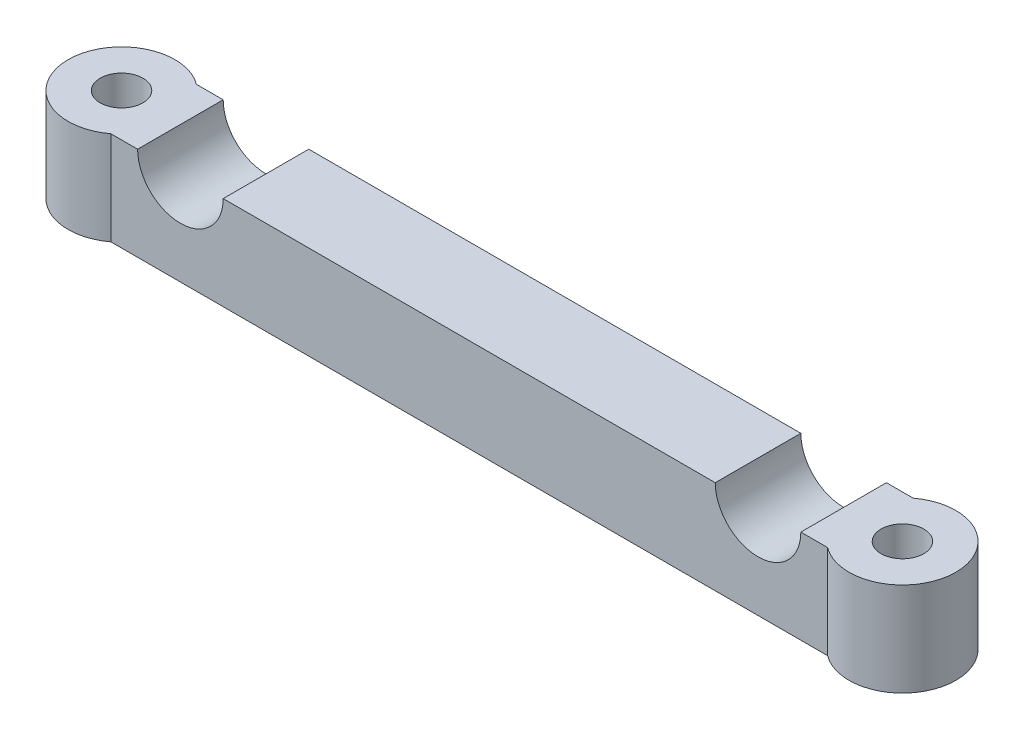
ISO-10303-21;
HEADER;
FILE_DESCRIPTION(('STEP AP214'),'2;1');
FILE_NAME('part.step','',(''),(''),'','','');
FILE_SCHEMA(('AUTOMOTIVE_DESIGN { 1 0 10303 214 1 1 1 1 }'));
ENDSEC;
DATA;
#1=APPLICATION_CONTEXT('core data for automotive mechanical design processes');
#2=APPLICATION_PROTOCOL_DEFINITION('international standard','automotive_design',2000,#1);
#3=PRODUCT_CONTEXT('',#1,'mechanical');
#4=PRODUCT('Part','Part','',(#3));
#5=PRODUCT_RELATED_PRODUCT_CATEGORY('part','',(#4));
#6=PRODUCT_DEFINITION_FORMATION('','',#4);
#7=PRODUCT_DEFINITION_CONTEXT('part definition',#1,'design');
#8=PRODUCT_DEFINITION('design','',#6,#7);
#9=PRODUCT_DEFINITION_SHAPE('','',#8);
#10=(LENGTH_UNIT() NAMED_UNIT(*) SI_UNIT(.MILLI.,.METRE.));
#11=(NAMED_UNIT(*) PLANE_ANGLE_UNIT() SI_UNIT($,.RADIAN.));
#12=(NAMED_UNIT(*) SI_UNIT($,.STERADIAN.) SOLID_ANGLE_UNIT());
#13=UNCERTAINTY_MEASURE_WITH_UNIT(LENGTH_MEASURE(1.E-05),#10,'distance_accuracy_value','');
#14=(GEOMETRIC_REPRESENTATION_CONTEXT(3) GLOBAL_UNCERTAINTY_ASSIGNED_CONTEXT((#13)) GLOBAL_UNIT_ASSIGNED_CONTEXT((#10,
#11,#12)) REPRESENTATION_CONTEXT('',''));
#15=CARTESIAN_POINT('',(0.,0.,0.));
#16=DIRECTION('',(0.,0.,1.));
#17=DIRECTION('',(1.,0.,0.));
#18=AXIS2_PLACEMENT_3D('',#15,#16,#17);
#19=CARTESIAN_POINT('',(57.94375,13.89888,0.));
#20=DIRECTION('',(0.,-1.,0.));
#21=DIRECTION('',(0.,0.,-1.));
#22=AXIS2_PLACEMENT_3D('',#19,#20,#21);
#23=PLANE('',#22);
#24=DIRECTION('',(-1.,0.,0.));
#25=VECTOR('',#24,1.);
#26=CARTESIAN_POINT('',(-53.18125,13.89888,-6.35));
#27=LINE('',#26,#25);
#28=CARTESIAN_POINT('',(36.5125,13.89888,-6.35));
#29=VERTEX_POINT('',#28);
#30=CARTESIAN_POINT('',(-36.5125,13.89888,-6.35));
#31=VERTEX_POINT('',#30);
#32=EDGE_CURVE('E118',#29,#31,#27,.T.);
#33=ORIENTED_EDGE('',*,*,#32,.T.);
#34=DIRECTION('',(0.,0.,1.));
#35=VECTOR('',#34,1.);
#36=CARTESIAN_POINT('',(-36.5125,13.89888,-7.9375));
#37=LINE('',#36,#35);
#38=CARTESIAN_POINT('',(-36.5125,13.89888,6.35));
#39=VERTEX_POINT('',#38);
#40=EDGE_CURVE('E11',#31,#39,#37,.T.);
#41=ORIENTED_EDGE('',*,*,#40,.T.);
#42=DIRECTION('',(1.,0.,0.));
#43=VECTOR('',#42,1.);
#44=CARTESIAN_POINT('',(-53.18125,13.89888,6.35));
#45=LINE('',#44,#43);
#46=CARTESIAN_POINT('',(36.5125,13.89888,6.35));
#47=VERTEX_POINT('',#46);
#48=EDGE_CURVE('E170',#39,#47,#45,.T.);
#49=ORIENTED_EDGE('',*,*,#48,.T.);
#50=DIRECTION('',(0.,0.,1.));
#51=VECTOR('',#50,1.);
#52=CARTESIAN_POINT('',(36.5125,13.89888,-7.9375));
#53=LINE('',#52,#51);
#54=EDGE_CURVE('E108',#47,#29,#53,.F.);
#55=ORIENTED_EDGE('',*,*,#54,.T.);
#56=EDGE_LOOP('',(#33,#41,#49,#55));
#57=FACE_BOUND('',#56,.T.);
#58=ADVANCED_FACE('F38',(#57),#23,.F.);
#59=CARTESIAN_POINT('',(57.94375,13.89888,0.));
#60=DIRECTION('',(0.,1.,0.));
#61=DIRECTION('',(0.,0.,1.));
#62=AXIS2_PLACEMENT_3D('',#59,#60,#61);
#63=CIRCLE('',#62,3.175);
#64=CARTESIAN_POINT('',(57.94375,13.89888,3.175));
#65=VERTEX_POINT('',#64);
#66=EDGE_CURVE('E145',#65,#65,#63,.T.);
#67=ORIENTED_EDGE('',*,*,#66,.F.);
#68=EDGE_LOOP('',(#67));
#69=FACE_BOUND('',#68,.T.);
#70=CARTESIAN_POINT('',(53.18125,13.89888,-6.35));
#71=VERTEX_POINT('',#70);
#72=CARTESIAN_POINT('',(49.2125,13.89888,-6.35));
#73=VERTEX_POINT('',#72);
#74=EDGE_CURVE('E115',#71,#73,#27,.T.);
#75=ORIENTED_EDGE('',*,*,#74,.T.);
#76=DIRECTION('',(0.,0.,1.));
#77=VECTOR('',#76,1.);
#78=CARTESIAN_POINT('',(49.2125,13.89888,-7.9375));
#79=LINE('',#78,#77);
#80=CARTESIAN_POINT('',(49.2125,13.89888,6.35));
#81=VERTEX_POINT('',#80);
#82=EDGE_CURVE('E101',#73,#81,#79,.T.);
#83=ORIENTED_EDGE('',*,*,#82,.T.);
#84=CARTESIAN_POINT('',(53.18125,13.89888,6.35));
#85=VERTEX_POINT('',#84);
#86=EDGE_CURVE('E128',#81,#85,#45,.T.);
#87=ORIENTED_EDGE('',*,*,#86,.T.);
#88=CARTESIAN_POINT('',(57.94375,13.89888,0.));
#89=DIRECTION('',(0.,1.,0.));
#90=DIRECTION('',(0.,0.,-1.));
#91=AXIS2_PLACEMENT_3D('',#88,#89,#90);
#92=CIRCLE('',#91,7.9375);
#93=EDGE_CURVE('E123',#85,#71,#92,.T.);
#94=ORIENTED_EDGE('',*,*,#93,.T.);
#95=EDGE_LOOP('',(#75,#83,#87,#94));
#96=FACE_BOUND('',#95,.T.);
#97=ADVANCED_FACE('F121',(#69,#96),#23,.F.);
#98=CARTESIAN_POINT('',(57.94375,13.89888,0.));
#99=DIRECTION('',(0.,-1.,0.));
#100=DIRECTION('',(0.,0.,-1.));
#101=AXIS2_PLACEMENT_3D('',#98,#99,#100);
#102=CYLINDRICAL_SURFACE('',#101,7.9375);
#103=CARTESIAN_POINT('',(57.94375,0.,0.));
#104=DIRECTION('',(0.,1.,0.));
#105=DIRECTION('',(0.,0.,-1.));
#106=AXIS2_PLACEMENT_3D('',#103,#104,#105);
#107=CIRCLE('',#106,7.9375);
#108=CARTESIAN_POINT('',(53.18125,0.,6.35));
#109=VERTEX_POINT('',#108);
#110=CARTESIAN_POINT('',(53.18125,0.,-6.35));
#111=VERTEX_POINT('',#110);
#112=EDGE_CURVE('E138',#109,#111,#107,.T.);
#113=ORIENTED_EDGE('',*,*,#112,.T.);
#114=DIRECTION('',(0.,-1.,0.));
#115=VECTOR('',#114,1.);
#116=CARTESIAN_POINT('',(53.18125,13.89888,-6.35));
#117=LINE('',#116,#115);
#118=EDGE_CURVE('E183',#71,#111,#117,.T.);
#119=ORIENTED_EDGE('',*,*,#118,.F.);
#120=ORIENTED_EDGE('',*,*,#93,.F.);
#121=DIRECTION('',(0.,-1.,0.));
#122=VECTOR('',#121,1.);
#123=CARTESIAN_POINT('',(53.18125,13.89888,6.35));
#124=LINE('',#123,#122);
#125=EDGE_CURVE('E169',#85,#109,#124,.T.);
#126=ORIENTED_EDGE('',*,*,#125,.T.);
#127=EDGE_LOOP('',(#113,#119,#120,#126));
#128=FACE_BOUND('',#127,.T.);
#129=ADVANCED_FACE('F40',(#128),#102,.T.);
#130=CARTESIAN_POINT('',(-53.18125,13.89888,-6.35));
#131=DIRECTION('',(0.,0.,1.));
#132=DIRECTION('',(1.,0.,0.));
#133=AXIS2_PLACEMENT_3D('',#130,#131,#132);
#134=PLANE('',#133);
#135=CARTESIAN_POINT('',(-49.2125,13.89888,-6.35));
#136=VERTEX_POINT('',#135);
#137=CARTESIAN_POINT('',(-53.18125,13.89888,-6.35));
#138=VERTEX_POINT('',#137);
#139=EDGE_CURVE('E127',#136,#138,#27,.T.);
#140=ORIENTED_EDGE('',*,*,#139,.F.);
#141=CARTESIAN_POINT('',(-42.8625,13.89888,-6.35));
#142=DIRECTION('',(0.,0.,1.));
#143=DIRECTION('',(1.,0.,0.));
#144=AXIS2_PLACEMENT_3D('',#141,#142,#143);
#145=CIRCLE('',#144,6.35);
#146=EDGE_CURVE('E53',#136,#31,#145,.T.);
#147=ORIENTED_EDGE('',*,*,#146,.T.);
#148=ORIENTED_EDGE('',*,*,#32,.F.);
#149=CARTESIAN_POINT('',(42.8625,13.89888,-6.35));
#150=DIRECTION('',(0.,0.,1.));
#151=DIRECTION('',(1.,0.,0.));
#152=AXIS2_PLACEMENT_3D('',#149,#150,#151);
#153=CIRCLE('',#152,6.35);
#154=EDGE_CURVE('E61',#29,#73,#153,.T.);
#155=ORIENTED_EDGE('',*,*,#154,.T.);
#156=ORIENTED_EDGE('',*,*,#74,.F.);
#157=ORIENTED_EDGE('',*,*,#118,.T.);
#158=DIRECTION('',(-1.,0.,0.));
#159=VECTOR('',#158,1.);
#160=CARTESIAN_POINT('',(-53.18125,0.,-6.35));
#161=LINE('',#160,#159);
#162=CARTESIAN_POINT('',(-53.18125,0.,-6.35));
#163=VERTEX_POINT('',#162);
#164=EDGE_CURVE('E192',#111,#163,#161,.T.);
#165=ORIENTED_EDGE('',*,*,#164,.T.);
#166=DIRECTION('',(0.,-1.,0.));
#167=VECTOR('',#166,1.);
#168=CARTESIAN_POINT('',(-53.18125,13.89888,-6.35));
#169=LINE('',#168,#167);
#170=EDGE_CURVE('E184',#138,#163,#169,.T.);
#171=ORIENTED_EDGE('',*,*,#170,.F.);
#172=EDGE_LOOP('',(#140,#147,#148,#155,#156,#157,#165,#171));
#173=FACE_BOUND('',#172,.T.);
#174=ADVANCED_FACE('F113',(#173),#134,.F.);
#175=CARTESIAN_POINT('',(-57.94375,13.89888,0.));
#176=DIRECTION('',(0.,-1.,0.));
#177=DIRECTION('',(0.,0.,-1.));
#178=AXIS2_PLACEMENT_3D('',#175,#176,#177);
#179=CYLINDRICAL_SURFACE('',#178,7.9375);
#180=CARTESIAN_POINT('',(-57.94375,0.,0.));
#181=DIRECTION('',(0.,1.,0.));
#182=DIRECTION('',(0.,0.,1.));
#183=AXIS2_PLACEMENT_3D('',#180,#181,#182);
#184=CIRCLE('',#183,7.9375);
#185=CARTESIAN_POINT('',(-53.18125,0.,6.35));
#186=VERTEX_POINT('',#185);
#187=EDGE_CURVE('E134',#163,#186,#184,.T.);
#188=ORIENTED_EDGE('',*,*,#187,.T.);
#189=DIRECTION('',(0.,-1.,0.));
#190=VECTOR('',#189,1.);
#191=CARTESIAN_POINT('',(-53.18125,13.89888,6.35));
#192=LINE('',#191,#190);
#193=CARTESIAN_POINT('',(-53.18125,13.89888,6.35));
#194=VERTEX_POINT('',#193);
#195=EDGE_CURVE('E173',#194,#186,#192,.T.);
#196=ORIENTED_EDGE('',*,*,#195,.F.);
#197=CARTESIAN_POINT('',(-57.94375,13.89888,0.));
#198=DIRECTION('',(0.,1.,0.));
#199=DIRECTION('',(0.,0.,1.));
#200=AXIS2_PLACEMENT_3D('',#197,#198,#199);
#201=CIRCLE('',#200,7.9375);
#202=EDGE_CURVE('E125',#138,#194,#201,.T.);
#203=ORIENTED_EDGE('',*,*,#202,.F.);
#204=ORIENTED_EDGE('',*,*,#170,.T.);
#205=EDGE_LOOP('',(#188,#196,#203,#204));
#206=FACE_BOUND('',#205,.T.);
#207=ADVANCED_FACE('F196',(#206),#179,.T.);
#208=CARTESIAN_POINT('',(-53.18125,13.89888,6.35));
#209=DIRECTION('',(0.,0.,-1.));
#210=DIRECTION('',(-1.,0.,0.));
#211=AXIS2_PLACEMENT_3D('',#208,#209,#210);
#212=PLANE('',#211);
#213=ORIENTED_EDGE('',*,*,#48,.F.);
#214=CARTESIAN_POINT('',(-42.8625,13.89888,6.35));
#215=DIRECTION('',(0.,0.,-1.));
#216=DIRECTION('',(-1.,0.,0.));
#217=AXIS2_PLACEMENT_3D('',#214,#215,#216);
#218=CIRCLE('',#217,6.35);
#219=CARTESIAN_POINT('',(-49.2125,13.89888,6.35));
#220=VERTEX_POINT('',#219);
#221=EDGE_CURVE('E119',#39,#220,#218,.T.);
#222=ORIENTED_EDGE('',*,*,#221,.T.);
#223=EDGE_CURVE('E164',#194,#220,#45,.T.);
#224=ORIENTED_EDGE('',*,*,#223,.F.);
#225=ORIENTED_EDGE('',*,*,#195,.T.);
#226=DIRECTION('',(1.,0.,0.));
#227=VECTOR('',#226,1.);
#228=CARTESIAN_POINT('',(-53.18125,0.,6.35));
#229=LINE('',#228,#227);
#230=EDGE_CURVE('E133',#186,#109,#229,.T.);
#231=ORIENTED_EDGE('',*,*,#230,.T.);
#232=ORIENTED_EDGE('',*,*,#125,.F.);
#233=ORIENTED_EDGE('',*,*,#86,.F.);
#234=CARTESIAN_POINT('',(42.8625,13.89888,6.35));
#235=DIRECTION('',(0.,0.,-1.));
#236=DIRECTION('',(-1.,0.,0.));
#237=AXIS2_PLACEMENT_3D('',#234,#235,#236);
#238=CIRCLE('',#237,6.35);
#239=EDGE_CURVE('E104',#81,#47,#238,.T.);
#240=ORIENTED_EDGE('',*,*,#239,.T.);
#241=EDGE_LOOP('',(#213,#222,#224,#225,#231,#232,#233,#240));
#242=FACE_BOUND('',#241,.T.);
#243=ADVANCED_FACE('F160',(#242),#212,.F.);
#244=CARTESIAN_POINT('',(-57.94375,13.89888,0.));
#245=DIRECTION('',(0.,1.,0.));
#246=DIRECTION('',(0.,0.,1.));
#247=AXIS2_PLACEMENT_3D('',#244,#245,#246);
#248=CIRCLE('',#247,3.175);
#249=CARTESIAN_POINT('',(-57.94375,13.89888,3.175));
#250=VERTEX_POINT('',#249);
#251=EDGE_CURVE('E151',#250,#250,#248,.T.);
#252=ORIENTED_EDGE('',*,*,#251,.F.);
#253=EDGE_LOOP('',(#252));
#254=FACE_BOUND('',#253,.T.);
#255=ORIENTED_EDGE('',*,*,#223,.T.);
#256=DIRECTION('',(0.,0.,1.));
#257=VECTOR('',#256,1.);
#258=CARTESIAN_POINT('',(-49.2125,13.89888,-7.9375));
#259=LINE('',#258,#257);
#260=EDGE_CURVE('E46',#220,#136,#259,.F.);
#261=ORIENTED_EDGE('',*,*,#260,.T.);
#262=ORIENTED_EDGE('',*,*,#139,.T.);
#263=ORIENTED_EDGE('',*,*,#202,.T.);
#264=EDGE_LOOP('',(#255,#261,#262,#263));
#265=FACE_BOUND('',#264,.T.);
#266=ADVANCED_FACE('F157',(#254,#265),#23,.F.);
#267=CARTESIAN_POINT('',(57.94375,0.,0.));
#268=DIRECTION('',(0.,-1.,0.));
#269=DIRECTION('',(0.,0.,-1.));
#270=AXIS2_PLACEMENT_3D('',#267,#268,#269);
#271=PLANE('',#270);
#272=CARTESIAN_POINT('',(-57.94375,0.,0.));
#273=DIRECTION('',(0.,1.,0.));
#274=DIRECTION('',(0.,0.,1.));
#275=AXIS2_PLACEMENT_3D('',#272,#273,#274);
#276=CIRCLE('',#275,3.175);
#277=CARTESIAN_POINT('',(-57.94375,0.,3.175));
#278=VERTEX_POINT('',#277);
#279=EDGE_CURVE('E148',#278,#278,#276,.T.);
#280=ORIENTED_EDGE('',*,*,#279,.T.);
#281=EDGE_LOOP('',(#280));
#282=FACE_BOUND('',#281,.T.);
#283=CARTESIAN_POINT('',(57.94375,0.,0.));
#284=DIRECTION('',(0.,1.,0.));
#285=DIRECTION('',(0.,0.,1.));
#286=AXIS2_PLACEMENT_3D('',#283,#284,#285);
#287=CIRCLE('',#286,3.175);
#288=CARTESIAN_POINT('',(57.94375,0.,3.175));
#289=VERTEX_POINT('',#288);
#290=EDGE_CURVE('E142',#289,#289,#287,.T.);
#291=ORIENTED_EDGE('',*,*,#290,.T.);
#292=EDGE_LOOP('',(#291));
#293=FACE_BOUND('',#292,.T.);
#294=ORIENTED_EDGE('',*,*,#112,.F.);
#295=ORIENTED_EDGE('',*,*,#230,.F.);
#296=ORIENTED_EDGE('',*,*,#187,.F.);
#297=ORIENTED_EDGE('',*,*,#164,.F.);
#298=EDGE_LOOP('',(#294,#295,#296,#297));
#299=FACE_BOUND('',#298,.T.);
#300=ADVANCED_FACE('F159',(#282,#293,#299),#271,.T.);
#301=CARTESIAN_POINT('',(42.8625,13.89888,-7.9375));
#302=DIRECTION('',(0.,0.,1.));
#303=DIRECTION('',(1.,0.,0.));
#304=AXIS2_PLACEMENT_3D('',#301,#302,#303);
#305=CYLINDRICAL_SURFACE('',#304,6.35);
#306=ORIENTED_EDGE('',*,*,#54,.F.);
#307=ORIENTED_EDGE('',*,*,#239,.F.);
#308=ORIENTED_EDGE('',*,*,#82,.F.);
#309=ORIENTED_EDGE('',*,*,#154,.F.);
#310=EDGE_LOOP('',(#306,#307,#308,#309));
#311=FACE_BOUND('',#310,.T.);
#312=ADVANCED_FACE('F102',(#311),#305,.F.);
#313=CARTESIAN_POINT('',(-42.8625,13.89888,-7.9375));
#314=DIRECTION('',(0.,0.,1.));
#315=DIRECTION('',(1.,0.,0.));
#316=AXIS2_PLACEMENT_3D('',#313,#314,#315);
#317=CYLINDRICAL_SURFACE('',#316,6.35);
#318=ORIENTED_EDGE('',*,*,#260,.F.);
#319=ORIENTED_EDGE('',*,*,#221,.F.);
#320=ORIENTED_EDGE('',*,*,#40,.F.);
#321=ORIENTED_EDGE('',*,*,#146,.F.);
#322=EDGE_LOOP('',(#318,#319,#320,#321));
#323=FACE_BOUND('',#322,.T.);
#324=ADVANCED_FACE('F203',(#323),#317,.F.);
#325=CARTESIAN_POINT('',(57.94375,13.89888,0.));
#326=DIRECTION('',(0.,1.,0.));
#327=DIRECTION('',(0.,0.,1.));
#328=AXIS2_PLACEMENT_3D('',#325,#326,#327);
#329=CYLINDRICAL_SURFACE('',#328,3.175);
#330=ORIENTED_EDGE('',*,*,#290,.F.);
#331=EDGE_LOOP('',(#330));
#332=FACE_BOUND('',#331,.T.);
#333=ORIENTED_EDGE('',*,*,#66,.T.);
#334=EDGE_LOOP('',(#333));
#335=FACE_BOUND('',#334,.T.);
#336=ADVANCED_FACE('F216',(#332,#335),#329,.F.);
#337=CARTESIAN_POINT('',(-57.94375,13.89888,0.));
#338=DIRECTION('',(0.,1.,0.));
#339=DIRECTION('',(0.,0.,1.));
#340=AXIS2_PLACEMENT_3D('',#337,#338,#339);
#341=CYLINDRICAL_SURFACE('',#340,3.175);
#342=ORIENTED_EDGE('',*,*,#279,.F.);
#343=EDGE_LOOP('',(#342));
#344=FACE_BOUND('',#343,.T.);
#345=ORIENTED_EDGE('',*,*,#251,.T.);
#346=EDGE_LOOP('',(#345));
#347=FACE_BOUND('',#346,.T.);
#348=ADVANCED_FACE('F155',(#344,#347),#341,.F.);
#349=CLOSED_SHELL('',(#58,#97,#129,#174,#207,#243,#266,#300,#312,#324,#336,#348));
#350=MANIFOLD_SOLID_BREP('B2',#349);
#351=ADVANCED_BREP_SHAPE_REPRESENTATION('',(#18,#350),#14);
#352=SHAPE_DEFINITION_REPRESENTATION(#9,#351);
ENDSEC;
END-ISO-10303-21;
